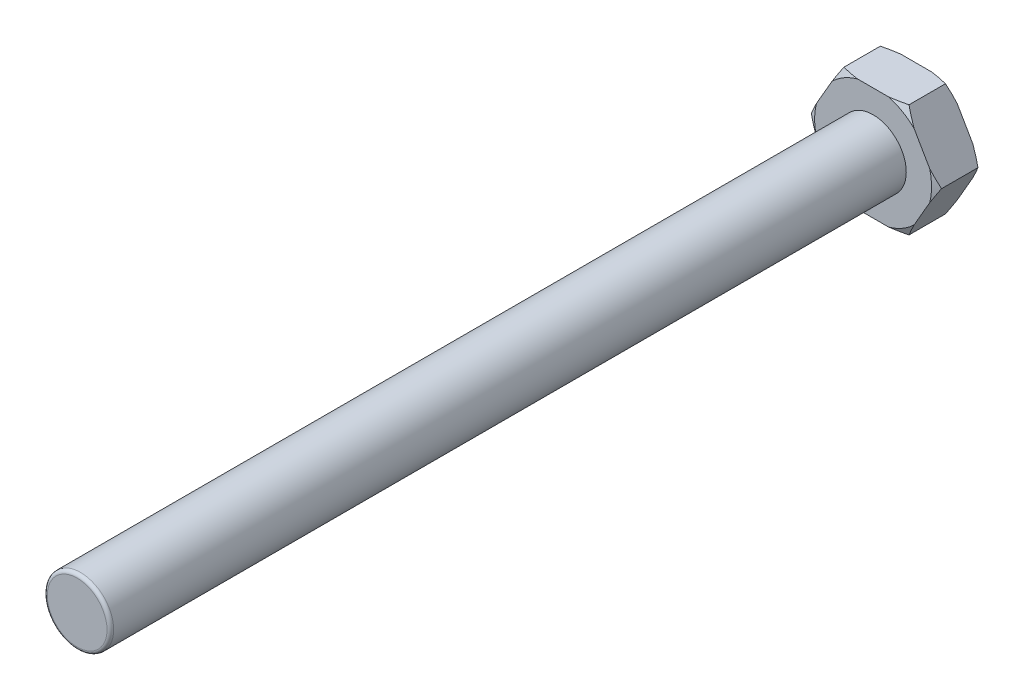
ISO-10303-21;
HEADER;
FILE_DESCRIPTION(('STEP AP214'),'2;1');
FILE_NAME('part.step','',(''),(''),'','','');
FILE_SCHEMA(('AUTOMOTIVE_DESIGN { 1 0 10303 214 1 1 1 1 }'));
ENDSEC;
DATA;
#1=APPLICATION_CONTEXT('core data for automotive mechanical design processes');
#2=APPLICATION_PROTOCOL_DEFINITION('international standard','automotive_design',2000,#1);
#3=PRODUCT_CONTEXT('',#1,'mechanical');
#4=PRODUCT('Part','Part','',(#3));
#5=PRODUCT_RELATED_PRODUCT_CATEGORY('part','',(#4));
#6=PRODUCT_DEFINITION_FORMATION('','',#4);
#7=PRODUCT_DEFINITION_CONTEXT('part definition',#1,'design');
#8=PRODUCT_DEFINITION('design','',#6,#7);
#9=PRODUCT_DEFINITION_SHAPE('','',#8);
#10=(LENGTH_UNIT() NAMED_UNIT(*) SI_UNIT(.MILLI.,.METRE.));
#11=(NAMED_UNIT(*) PLANE_ANGLE_UNIT() SI_UNIT($,.RADIAN.));
#12=(NAMED_UNIT(*) SI_UNIT($,.STERADIAN.) SOLID_ANGLE_UNIT());
#13=UNCERTAINTY_MEASURE_WITH_UNIT(LENGTH_MEASURE(1.E-05),#10,'distance_accuracy_value','');
#14=(GEOMETRIC_REPRESENTATION_CONTEXT(3) GLOBAL_UNCERTAINTY_ASSIGNED_CONTEXT((#13)) GLOBAL_UNIT_ASSIGNED_CONTEXT((#10,
#11,#12)) REPRESENTATION_CONTEXT('',''));
#15=CARTESIAN_POINT('',(0.,0.,0.));
#16=DIRECTION('',(0.,0.,1.));
#17=DIRECTION('',(1.,0.,0.));
#18=AXIS2_PLACEMENT_3D('',#15,#16,#17);
#19=CARTESIAN_POINT('',(0.,0.,6.5));
#20=DIRECTION('',(0.,0.,1.));
#21=DIRECTION('',(1.,0.,0.));
#22=AXIS2_PLACEMENT_3D('',#19,#20,#21);
#23=PLANE('',#22);
#24=CARTESIAN_POINT('',(0.,0.,6.5));
#25=DIRECTION('',(0.,0.,1.));
#26=DIRECTION('',(1.,0.,0.));
#27=AXIS2_PLACEMENT_3D('',#24,#25,#26);
#28=CIRCLE('',#27,5.);
#29=CARTESIAN_POINT('',(5.,0.,6.5));
#30=VERTEX_POINT('',#29);
#31=EDGE_CURVE('E219',#30,#30,#28,.T.);
#32=ORIENTED_EDGE('',*,*,#31,.F.);
#33=EDGE_LOOP('',(#32));
#34=FACE_BOUND('',#33,.T.);
#35=CARTESIAN_POINT('',(0.,0.,6.5));
#36=DIRECTION('',(0.,0.,1.));
#37=DIRECTION('',(1.,0.,0.));
#38=AXIS2_PLACEMENT_3D('',#35,#36,#37);
#39=CIRCLE('',#38,8.8149545762236);
#40=CARTESIAN_POINT('',(6.19358754726897,-6.27239168700426,6.5));
#41=VERTEX_POINT('',#40);
#42=CARTESIAN_POINT('',(2.33525676979781,-8.49999999999994,6.5));
#43=VERTEX_POINT('',#42);
#44=EDGE_CURVE('E226',#41,#43,#39,.F.);
#45=ORIENTED_EDGE('',*,*,#44,.F.);
#46=DIRECTION('',(0.499999999999995,0.866025403784442,0.));
#47=VECTOR('',#46,1.);
#48=CARTESIAN_POINT('',(4.9074772881119,-8.49999999999991,6.5));
#49=LINE('',#48,#47);
#50=CARTESIAN_POINT('',(8.52884431706653,-2.22760831299566,6.5));
#51=VERTEX_POINT('',#50);
#52=EDGE_CURVE('E202',#41,#51,#49,.T.);
#53=ORIENTED_EDGE('',*,*,#52,.T.);
#54=CARTESIAN_POINT('',(8.52884431706655,2.22760831299558,6.5));
#55=VERTEX_POINT('',#54);
#56=EDGE_CURVE('E224',#55,#51,#39,.F.);
#57=ORIENTED_EDGE('',*,*,#56,.F.);
#58=DIRECTION('',(-0.500000000000001,0.866025403784438,0.));
#59=VECTOR('',#58,1.);
#60=CARTESIAN_POINT('',(9.8149545762236,0.,6.5));
#61=LINE('',#60,#59);
#62=CARTESIAN_POINT('',(6.19358754726883,6.2723916870044,6.5));
#63=VERTEX_POINT('',#62);
#64=EDGE_CURVE('E257',#55,#63,#61,.T.);
#65=ORIENTED_EDGE('',*,*,#64,.T.);
#66=CARTESIAN_POINT('',(2.33525676979769,8.49999999999997,6.5));
#67=VERTEX_POINT('',#66);
#68=EDGE_CURVE('E225',#67,#63,#39,.F.);
#69=ORIENTED_EDGE('',*,*,#68,.F.);
#70=DIRECTION('',(-1.,0.,0.));
#71=VECTOR('',#70,1.);
#72=CARTESIAN_POINT('',(4.90747728811178,8.49999999999998,6.5));
#73=LINE('',#72,#71);
#74=CARTESIAN_POINT('',(-2.33525676979774,8.49999999999996,6.5));
#75=VERTEX_POINT('',#74);
#76=EDGE_CURVE('E263',#67,#75,#73,.T.);
#77=ORIENTED_EDGE('',*,*,#76,.T.);
#78=CARTESIAN_POINT('',(-6.19358754726888,6.27239168700436,6.5));
#79=VERTEX_POINT('',#78);
#80=EDGE_CURVE('E236',#79,#75,#39,.F.);
#81=ORIENTED_EDGE('',*,*,#80,.F.);
#82=DIRECTION('',(-0.499999999999995,-0.866025403784442,0.));
#83=VECTOR('',#82,1.);
#84=CARTESIAN_POINT('',(-4.90747728811184,8.49999999999995,6.5));
#85=LINE('',#84,#83);
#86=CARTESIAN_POINT('',(-8.52884431706657,2.22760831299552,6.5));
#87=VERTEX_POINT('',#86);
#88=EDGE_CURVE('E265',#79,#87,#85,.T.);
#89=ORIENTED_EDGE('',*,*,#88,.T.);
#90=CARTESIAN_POINT('',(-8.52884431706654,-2.22760831299564,6.5));
#91=VERTEX_POINT('',#90);
#92=EDGE_CURVE('E234',#91,#87,#39,.F.);
#93=ORIENTED_EDGE('',*,*,#92,.F.);
#94=DIRECTION('',(0.500000000000007,-0.866025403784434,0.));
#95=VECTOR('',#94,1.);
#96=CARTESIAN_POINT('',(-9.8149545762236,0.,6.5));
#97=LINE('',#96,#95);
#98=CARTESIAN_POINT('',(-6.19358754726878,-6.27239168700445,6.5));
#99=VERTEX_POINT('',#98);
#100=EDGE_CURVE('E272',#91,#99,#97,.T.);
#101=ORIENTED_EDGE('',*,*,#100,.T.);
#102=CARTESIAN_POINT('',(-2.33525676979763,-8.49999999999999,6.5));
#103=VERTEX_POINT('',#102);
#104=EDGE_CURVE('E230',#103,#99,#39,.F.);
#105=ORIENTED_EDGE('',*,*,#104,.F.);
#106=DIRECTION('',(1.,0.,0.));
#107=VECTOR('',#106,1.);
#108=CARTESIAN_POINT('',(-4.90747728811172,-8.50000000000001,6.5));
#109=LINE('',#108,#107);
#110=EDGE_CURVE('E207',#103,#43,#109,.T.);
#111=ORIENTED_EDGE('',*,*,#110,.T.);
#112=EDGE_LOOP('',(#45,#53,#57,#65,#69,#77,#81,#89,#93,#101,#105,#111));
#113=FACE_BOUND('',#112,.T.);
#114=ADVANCED_FACE('F38',(#34,#113),#23,.T.);
#115=CARTESIAN_POINT('',(0.,0.,0.));
#116=DIRECTION('',(0.,0.,1.));
#117=DIRECTION('',(1.,0.,0.));
#118=AXIS2_PLACEMENT_3D('',#115,#116,#117);
#119=PLANE('',#118);
#120=DIRECTION('',(0.499999999999995,0.866025403784442,0.));
#121=VECTOR('',#120,1.);
#122=CARTESIAN_POINT('',(4.9074772881119,-8.49999999999991,0.));
#123=LINE('',#122,#121);
#124=CARTESIAN_POINT('',(6.19358754726897,-6.27239168700427,0.));
#125=VERTEX_POINT('',#124);
#126=CARTESIAN_POINT('',(8.52884431706654,-2.22760831299565,0.));
#127=VERTEX_POINT('',#126);
#128=EDGE_CURVE('E277',#125,#127,#123,.T.);
#129=ORIENTED_EDGE('',*,*,#128,.F.);
#130=CARTESIAN_POINT('',(0.,0.,0.));
#131=DIRECTION('',(0.,0.,1.));
#132=DIRECTION('',(1.,0.,0.));
#133=AXIS2_PLACEMENT_3D('',#130,#131,#132);
#134=CIRCLE('',#133,8.81495457622361);
#135=CARTESIAN_POINT('',(2.33525676979782,-8.49999999999994,0.));
#136=VERTEX_POINT('',#135);
#137=EDGE_CURVE('E223',#125,#136,#134,.F.);
#138=ORIENTED_EDGE('',*,*,#137,.T.);
#139=DIRECTION('',(1.,0.,0.));
#140=VECTOR('',#139,1.);
#141=CARTESIAN_POINT('',(-4.90747728811172,-8.50000000000001,0.));
#142=LINE('',#141,#140);
#143=CARTESIAN_POINT('',(-2.33525676979764,-8.49999999999999,0.));
#144=VERTEX_POINT('',#143);
#145=EDGE_CURVE('E194',#144,#136,#142,.T.);
#146=ORIENTED_EDGE('',*,*,#145,.F.);
#147=CARTESIAN_POINT('',(-6.19358754726878,-6.27239168700445,0.));
#148=VERTEX_POINT('',#147);
#149=EDGE_CURVE('E595',#144,#148,#134,.F.);
#150=ORIENTED_EDGE('',*,*,#149,.T.);
#151=DIRECTION('',(0.500000000000007,-0.866025403784434,0.));
#152=VECTOR('',#151,1.);
#153=CARTESIAN_POINT('',(-9.8149545762236,0.,0.));
#154=LINE('',#153,#152);
#155=CARTESIAN_POINT('',(-8.52884431706654,-2.22760831299563,0.));
#156=VERTEX_POINT('',#155);
#157=EDGE_CURVE('E190',#156,#148,#154,.T.);
#158=ORIENTED_EDGE('',*,*,#157,.F.);
#159=CARTESIAN_POINT('',(-8.52884431706657,2.22760831299551,0.));
#160=VERTEX_POINT('',#159);
#161=EDGE_CURVE('E172',#156,#160,#134,.F.);
#162=ORIENTED_EDGE('',*,*,#161,.T.);
#163=DIRECTION('',(-0.499999999999995,-0.866025403784442,0.));
#164=VECTOR('',#163,1.);
#165=CARTESIAN_POINT('',(-4.90747728811184,8.49999999999995,0.));
#166=LINE('',#165,#164);
#167=CARTESIAN_POINT('',(-6.19358754726887,6.27239168700436,0.));
#168=VERTEX_POINT('',#167);
#169=EDGE_CURVE('E180',#168,#160,#166,.T.);
#170=ORIENTED_EDGE('',*,*,#169,.F.);
#171=CARTESIAN_POINT('',(-2.33525676979775,8.49999999999995,0.));
#172=VERTEX_POINT('',#171);
#173=EDGE_CURVE('E162',#168,#172,#134,.F.);
#174=ORIENTED_EDGE('',*,*,#173,.T.);
#175=DIRECTION('',(-1.,0.,0.));
#176=VECTOR('',#175,1.);
#177=CARTESIAN_POINT('',(4.90747728811178,8.49999999999998,0.));
#178=LINE('',#177,#176);
#179=CARTESIAN_POINT('',(2.33525676979769,8.49999999999997,0.));
#180=VERTEX_POINT('',#179);
#181=EDGE_CURVE('E191',#180,#172,#178,.T.);
#182=ORIENTED_EDGE('',*,*,#181,.F.);
#183=CARTESIAN_POINT('',(6.19358754726883,6.27239168700441,0.));
#184=VERTEX_POINT('',#183);
#185=EDGE_CURVE('E173',#180,#184,#134,.F.);
#186=ORIENTED_EDGE('',*,*,#185,.T.);
#187=DIRECTION('',(-0.500000000000001,0.866025403784438,0.));
#188=VECTOR('',#187,1.);
#189=CARTESIAN_POINT('',(9.8149545762236,0.,0.));
#190=LINE('',#189,#188);
#191=CARTESIAN_POINT('',(8.52884431706655,2.22760831299557,0.));
#192=VERTEX_POINT('',#191);
#193=EDGE_CURVE('E196',#192,#184,#190,.T.);
#194=ORIENTED_EDGE('',*,*,#193,.F.);
#195=EDGE_CURVE('E220',#192,#127,#134,.F.);
#196=ORIENTED_EDGE('',*,*,#195,.T.);
#197=EDGE_LOOP('',(#129,#138,#146,#150,#158,#162,#170,#174,#182,#186,#194,#196));
#198=FACE_BOUND('',#197,.T.);
#199=ADVANCED_FACE('F188',(#198),#119,.F.);
#200=CARTESIAN_POINT('',(4.9074772881119,-8.49999999999991,6.5));
#201=DIRECTION('',(-0.866025403784442,0.499999999999995,0.));
#202=DIRECTION('',(-0.499999999999995,-0.866025403784442,0.));
#203=AXIS2_PLACEMENT_3D('',#200,#201,#202);
#204=PLANE('',#203);
#205=DIRECTION('',(0.,0.,-1.));
#206=VECTOR('',#205,1.);
#207=CARTESIAN_POINT('',(4.9074772881119,-8.49999999999991,6.5));
#208=LINE('',#207,#206);
#209=CARTESIAN_POINT('',(4.9074772881119,-8.49999999999991,6.));
#210=VERTEX_POINT('',#209);
#211=CARTESIAN_POINT('',(4.9074772881119,-8.49999999999991,0.5));
#212=VERTEX_POINT('',#211);
#213=EDGE_CURVE('E203',#210,#212,#208,.T.);
#214=ORIENTED_EDGE('',*,*,#213,.T.);
#215=CARTESIAN_POINT('',(4.90707314292347,-8.50069999999991,0.500202085074657));
#216=CARTESIAN_POINT('',(5.04539648047627,-8.26111695148596,0.431037001478398));
#217=CARTESIAN_POINT('',(5.18425872801676,-8.02060048349262,0.365975934098762));
#218=CARTESIAN_POINT('',(5.46308933900157,-7.53765169856145,0.245431881458196));
#219=CARTESIAN_POINT('',(5.6030582335775,-7.29521846167668,0.189953829261577));
#220=CARTESIAN_POINT('',(5.88419637238113,-6.80827292132343,0.0899457379592984));
#221=CARTESIAN_POINT('',(6.02536708724482,-6.56375807063871,0.0454320334196549));
#222=CARTESIAN_POINT('',(6.30853248030514,-6.073301222913,-0.03116883403363));
#223=CARTESIAN_POINT('',(6.45052701218303,-5.82735947930354,-0.0632581389788478));
#224=CARTESIAN_POINT('',(6.73189823105374,-5.34001023243189,-0.113316379068072));
#225=CARTESIAN_POINT('',(6.8712612725106,-5.09862636393127,-0.131588987679441));
#226=CARTESIAN_POINT('',(7.15027760794054,-4.61535589482493,-0.154517426261983));
#227=CARTESIAN_POINT('',(7.28993091588696,-4.37346927001667,-0.159172584752788));
#228=CARTESIAN_POINT('',(7.56903063475879,-3.89005437655246,-0.154685571909232));
#229=CARTESIAN_POINT('',(7.70847710644297,-3.64852600265924,-0.145558266834539));
#230=CARTESIAN_POINT('',(7.98697270856634,-3.16615747009707,-0.1138855746116));
#231=CARTESIAN_POINT('',(8.12602187186111,-2.92531725452058,-0.0913413312657054));
#232=CARTESIAN_POINT('',(8.3947556071356,-2.4598567713174,-0.0354617719109684));
#233=CARTESIAN_POINT('',(8.52448055000392,-2.23516657926049,-0.00289193103303866));
#234=CARTESIAN_POINT('',(8.78320155681667,-1.78704865047542,0.0723911259197545));
#235=CARTESIAN_POINT('',(8.91219754131855,-1.5636210513458,0.115105426524687));
#236=CARTESIAN_POINT('',(9.17078093553374,-1.11574147457147,0.210140846061156));
#237=CARTESIAN_POINT('',(9.30035889198645,-0.891305870454437,0.262563810605361));
#238=CARTESIAN_POINT('',(9.55856371514585,-0.444081997983007,0.375552841414267));
#239=CARTESIAN_POINT('',(9.68719099742968,-0.221293009827918,0.436115096597843));
#240=CARTESIAN_POINT('',(9.81535872141204,0.000699999999999254,0.500202085074658));
#241=B_SPLINE_CURVE_WITH_KNOTS('',3,(#215,#216,#217,#218,#219,#220,#221,#222,#223,#224,#225,
#226,#227,#228,#229,#230,#231,#232,#233,#234,#235,#236,#237,#238,#239,#240),.UNSPECIFIED.,.F.,
.F.,(4,2,2,2,2,2,2,2,2,2,2,2,4),(0.,0.855528802068646,1.71149670206993,2.56873220389179,
3.42581984794328,4.26347350481422,5.1011684659308,5.93796050441598,6.77468121607495,
7.55892436859336,8.34325140122722,9.13632729979281,9.92903313979536),.UNSPECIFIED.);
#242=EDGE_CURVE('E335',#212,#125,#241,.T.);
#243=ORIENTED_EDGE('',*,*,#242,.T.);
#244=ORIENTED_EDGE('',*,*,#128,.T.);
#245=CARTESIAN_POINT('',(9.8149545762236,0.,0.5));
#246=VERTEX_POINT('',#245);
#247=EDGE_CURVE('E602',#127,#246,#241,.T.);
#248=ORIENTED_EDGE('',*,*,#247,.T.);
#249=DIRECTION('',(0.,0.,-1.));
#250=VECTOR('',#249,1.);
#251=CARTESIAN_POINT('',(9.8149545762236,0.,6.5));
#252=LINE('',#251,#250);
#253=CARTESIAN_POINT('',(9.8149545762236,0.,6.));
#254=VERTEX_POINT('',#253);
#255=EDGE_CURVE('E217',#254,#246,#252,.T.);
#256=ORIENTED_EDGE('',*,*,#255,.F.);
#257=CARTESIAN_POINT('',(9.81535872141204,0.0007,5.99979791492534));
#258=CARTESIAN_POINT('',(9.67703538385924,-0.238883048513955,6.0689629985216));
#259=CARTESIAN_POINT('',(9.53817313631875,-0.479399516507293,6.13402406590124));
#260=CARTESIAN_POINT('',(9.25934252533394,-0.962348301438459,6.2545681185418));
#261=CARTESIAN_POINT('',(9.119373630758,-1.20478153832323,6.31004617073842));
#262=CARTESIAN_POINT('',(8.83823549195437,-1.69172707867648,6.4100542620407));
#263=CARTESIAN_POINT('',(8.69706477709069,-1.93624192936121,6.45456796658034));
#264=CARTESIAN_POINT('',(8.41389938403036,-2.42669877708691,6.53116883403363));
#265=CARTESIAN_POINT('',(8.27190485215247,-2.67264052069637,6.56325813897885));
#266=CARTESIAN_POINT('',(7.99053363328177,-3.15998976756802,6.61331637906807));
#267=CARTESIAN_POINT('',(7.8511705918249,-3.40137363606864,6.63158898767944));
#268=CARTESIAN_POINT('',(7.57215425639497,-3.88464410517498,6.65451742626198));
#269=CARTESIAN_POINT('',(7.43250094844855,-4.12653072998324,6.65917258475279));
#270=CARTESIAN_POINT('',(7.15340122957671,-4.60994562344745,6.65468557190923));
#271=CARTESIAN_POINT('',(7.01395475789253,-4.85147399734067,6.64555826683454));
#272=CARTESIAN_POINT('',(6.73545915576916,-5.33384252990285,6.6138855746116));
#273=CARTESIAN_POINT('',(6.59640999247439,-5.57468274547934,6.59134133126571));
#274=CARTESIAN_POINT('',(6.3276762571999,-6.04014322868252,6.53546177191097));
#275=CARTESIAN_POINT('',(6.19795131433158,-6.26483342073942,6.50289193103304));
#276=CARTESIAN_POINT('',(5.93923030751883,-6.71295134952449,6.42760887408024));
#277=CARTESIAN_POINT('',(5.81023432301695,-6.93637894865411,6.38489457347531));
#278=CARTESIAN_POINT('',(5.55165092880176,-7.38425852542844,6.28985915393884));
#279=CARTESIAN_POINT('',(5.42207297234905,-7.60869412954548,6.23743618939464));
#280=CARTESIAN_POINT('',(5.16386814918965,-8.05591800201691,6.12444715858573));
#281=CARTESIAN_POINT('',(5.03524086690583,-8.278706990172,6.06388490340216));
#282=CARTESIAN_POINT('',(4.90707314292347,-8.50069999999991,5.99979791492534));
#283=B_SPLINE_CURVE_WITH_KNOTS('',3,(#257,#258,#259,#260,#261,#262,#263,#264,#265,#266,#267,
#268,#269,#270,#271,#272,#273,#274,#275,#276,#277,#278,#279,#280,#281,#282),.UNSPECIFIED.,.F.,
.F.,(4,2,2,2,2,2,2,2,2,2,2,2,4),(0.,0.855528802068646,1.71149670206993,2.56873220389179,
3.42581984794329,4.26347350481422,5.1011684659308,5.93796050441599,6.77468121607495,
7.55892436859337,8.34325140122722,9.13632729979281,9.92903313979536),.UNSPECIFIED.);
#284=EDGE_CURVE('E279',#254,#51,#283,.T.);
#285=ORIENTED_EDGE('',*,*,#284,.T.);
#286=ORIENTED_EDGE('',*,*,#52,.F.);
#287=EDGE_CURVE('E371',#41,#210,#283,.T.);
#288=ORIENTED_EDGE('',*,*,#287,.T.);
#289=EDGE_LOOP('',(#214,#243,#244,#248,#256,#285,#286,#288));
#290=FACE_BOUND('',#289,.T.);
#291=ADVANCED_FACE('F384',(#290),#204,.F.);
#292=CARTESIAN_POINT('',(9.8149545762236,0.,6.5));
#293=DIRECTION('',(-0.866025403784438,-0.500000000000001,0.));
#294=DIRECTION('',(0.500000000000001,-0.866025403784438,0.));
#295=AXIS2_PLACEMENT_3D('',#292,#293,#294);
#296=PLANE('',#295);
#297=ORIENTED_EDGE('',*,*,#255,.T.);
#298=CARTESIAN_POINT('',(9.81535872141204,-0.000700000000000181,0.500202085074658));
#299=CARTESIAN_POINT('',(9.67703538385923,0.238883048513955,0.431037001478398));
#300=CARTESIAN_POINT('',(9.53817313631874,0.479399516507292,0.365975934098762));
#301=CARTESIAN_POINT('',(9.25934252533393,0.962348301438457,0.245431881458193));
#302=CARTESIAN_POINT('',(9.11937363075799,1.20478153832323,0.189953829261573));
#303=CARTESIAN_POINT('',(8.83823549195436,1.69172707867648,0.0899457379592926));
#304=CARTESIAN_POINT('',(8.69706477709067,1.9362419293612,0.0454320334196488));
#305=CARTESIAN_POINT('',(8.41389938403034,2.42669877708691,-0.031168834033639));
#306=CARTESIAN_POINT('',(8.27190485215245,2.67264052069637,-0.0632581389788593));
#307=CARTESIAN_POINT('',(7.99053363328174,3.15998976756801,-0.113316379068086));
#308=CARTESIAN_POINT('',(7.85117059182488,3.40137363606863,-0.131588987679455));
#309=CARTESIAN_POINT('',(7.57215425639493,3.88464410517497,-0.154517426261998));
#310=CARTESIAN_POINT('',(7.43250094844851,4.12653072998324,-0.159172584752804));
#311=CARTESIAN_POINT('',(7.15340122957668,4.60994562344745,-0.15468557190925));
#312=CARTESIAN_POINT('',(7.0139547578925,4.85147399734066,-0.145558266834557));
#313=CARTESIAN_POINT('',(6.73545915576912,5.33384252990284,-0.113885574611619));
#314=CARTESIAN_POINT('',(6.59640999247434,5.57468274547933,-0.0913413312657253));
#315=CARTESIAN_POINT('',(6.32767625719985,6.04014322868251,-0.0354617719109885));
#316=CARTESIAN_POINT('',(6.19795131433152,6.26483342073942,-0.00289193103305775));
#317=CARTESIAN_POINT('',(5.93923030751876,6.71295134952451,0.0723911259197379));
#318=CARTESIAN_POINT('',(5.81023432301688,6.93637894865414,0.115105426524672));
#319=CARTESIAN_POINT('',(5.55165092880167,7.38425852542848,0.210140846061144));
#320=CARTESIAN_POINT('',(5.42207297234896,7.60869412954552,0.262563810605351));
#321=CARTESIAN_POINT('',(5.16386814918955,8.05591800201696,0.375552841414262));
#322=CARTESIAN_POINT('',(5.03524086690572,8.27870699017206,0.43611509659784));
#323=CARTESIAN_POINT('',(4.90707314292335,8.50069999999998,0.500202085074658));
#324=B_SPLINE_CURVE_WITH_KNOTS('',3,(#298,#299,#300,#301,#302,#303,#304,#305,#306,#307,#308,
#309,#310,#311,#312,#313,#314,#315,#316,#317,#318,#319,#320,#321,#322,#323),.UNSPECIFIED.,.F.,
.F.,(4,2,2,2,2,2,2,2,2,2,2,2,4),(0.,0.855528802068648,1.71149670206993,2.56873220389179,
3.4258198479433,4.26347350481423,5.10116846593081,5.937960504416,6.77468121607496,
7.55892436859341,8.34325140122729,9.1363272997929,9.92903313979548),.UNSPECIFIED.);
#325=EDGE_CURVE('E284',#246,#192,#324,.T.);
#326=ORIENTED_EDGE('',*,*,#325,.T.);
#327=ORIENTED_EDGE('',*,*,#193,.T.);
#328=CARTESIAN_POINT('',(4.90747728811178,8.49999999999998,0.5));
#329=VERTEX_POINT('',#328);
#330=EDGE_CURVE('E283',#184,#329,#324,.T.);
#331=ORIENTED_EDGE('',*,*,#330,.T.);
#332=DIRECTION('',(0.,0.,-1.));
#333=VECTOR('',#332,1.);
#334=CARTESIAN_POINT('',(4.90747728811178,8.49999999999998,6.5));
#335=LINE('',#334,#333);
#336=CARTESIAN_POINT('',(4.90747728811178,8.49999999999998,6.));
#337=VERTEX_POINT('',#336);
#338=EDGE_CURVE('E214',#337,#329,#335,.T.);
#339=ORIENTED_EDGE('',*,*,#338,.F.);
#340=CARTESIAN_POINT('',(4.90707314292335,8.50069999999998,5.99979791492534));
#341=CARTESIAN_POINT('',(5.04539648047615,8.26111695148603,6.0689629985216));
#342=CARTESIAN_POINT('',(5.18425872801665,8.02060048349269,6.13402406590124));
#343=CARTESIAN_POINT('',(5.46308933900146,7.53765169856153,6.25456811854181));
#344=CARTESIAN_POINT('',(5.60305823357739,7.29521846167675,6.31004617073843));
#345=CARTESIAN_POINT('',(5.88419637238103,6.8082729213235,6.41005426204071));
#346=CARTESIAN_POINT('',(6.02536708724472,6.56375807063878,6.45456796658035));
#347=CARTESIAN_POINT('',(6.30853248030505,6.07330122291307,6.53116883403364));
#348=CARTESIAN_POINT('',(6.45052701218294,5.82735947930361,6.56325813897886));
#349=CARTESIAN_POINT('',(6.73189823105364,5.34001023243197,6.61331637906809));
#350=CARTESIAN_POINT('',(6.87126127251051,5.09862636393135,6.63158898767945));
#351=CARTESIAN_POINT('',(7.15027760794045,4.61535589482501,6.654517426262));
#352=CARTESIAN_POINT('',(7.28993091588687,4.37346927001674,6.65917258475281));
#353=CARTESIAN_POINT('',(7.56903063475871,3.89005437655253,6.65468557190925));
#354=CARTESIAN_POINT('',(7.70847710644289,3.64852600265932,6.64555826683456));
#355=CARTESIAN_POINT('',(7.98697270856627,3.16615747009714,6.61388557461162));
#356=CARTESIAN_POINT('',(8.12602187186104,2.92531725452065,6.59134133126572));
#357=CARTESIAN_POINT('',(8.39475560713554,2.45985677131747,6.53546177191099));
#358=CARTESIAN_POINT('',(8.52448055000387,2.23516657926056,6.50289193103306));
#359=CARTESIAN_POINT('',(8.78320155681663,1.78704865047547,6.42760887408026));
#360=CARTESIAN_POINT('',(8.91219754131851,1.56362105134585,6.38489457347533));
#361=CARTESIAN_POINT('',(9.17078093553372,1.1157414745715,6.28985915393886));
#362=CARTESIAN_POINT('',(9.30035889198643,0.891305870454463,6.23743618939465));
#363=CARTESIAN_POINT('',(9.55856371514584,0.44408199798302,6.12444715858574));
#364=CARTESIAN_POINT('',(9.68719099742967,0.221293009827924,6.06388490340216));
#365=CARTESIAN_POINT('',(9.81535872141204,-0.000699999999999481,5.99979791492534));
#366=B_SPLINE_CURVE_WITH_KNOTS('',3,(#340,#341,#342,#343,#344,#345,#346,#347,#348,#349,#350,
#351,#352,#353,#354,#355,#356,#357,#358,#359,#360,#361,#362,#363,#364,#365),.UNSPECIFIED.,.F.,
.F.,(4,2,2,2,2,2,2,2,2,2,2,2,4),(0.,0.855528802068649,1.71149670206993,2.56873220389179,
3.4258198479433,4.26347350481423,5.10116846593082,5.937960504416,6.77468121607497,
7.55892436859341,8.34325140122729,9.1363272997929,9.92903313979548),.UNSPECIFIED.);
#367=EDGE_CURVE('E245',#337,#63,#366,.T.);
#368=ORIENTED_EDGE('',*,*,#367,.T.);
#369=ORIENTED_EDGE('',*,*,#64,.F.);
#370=EDGE_CURVE('E259',#55,#254,#366,.T.);
#371=ORIENTED_EDGE('',*,*,#370,.T.);
#372=EDGE_LOOP('',(#297,#326,#327,#331,#339,#368,#369,#371));
#373=FACE_BOUND('',#372,.T.);
#374=ADVANCED_FACE('F255',(#373),#296,.F.);
#375=CARTESIAN_POINT('',(4.90747728811178,8.49999999999998,6.5));
#376=DIRECTION('',(0.,-1.,0.));
#377=DIRECTION('',(1.,0.,0.));
#378=AXIS2_PLACEMENT_3D('',#375,#376,#377);
#379=PLANE('',#378);
#380=ORIENTED_EDGE('',*,*,#338,.T.);
#381=CARTESIAN_POINT('',(4.90817728811178,8.49999999999998,0.500175009360382));
#382=CARTESIAN_POINT('',(4.63153297287082,8.49999999999998,0.431011657936858));
#383=CARTESIAN_POINT('',(4.35381085298517,8.49999999999998,0.365952333331763));
#384=CARTESIAN_POINT('',(3.79615443140122,8.49999999999998,0.245411752584145));
#385=CARTESIAN_POINT('',(3.51621906749012,8.49999999999998,0.189935429371367));
#386=CARTESIAN_POINT('',(2.95394774515309,8.49999999999998,0.0899307536760243));
#387=CARTESIAN_POINT('',(2.67160884583728,8.49999999999998,0.0454187340508896));
#388=CARTESIAN_POINT('',(2.10528319137797,8.49999999999997,-0.031178874757989));
#389=CARTESIAN_POINT('',(1.82129672885462,8.49999999999997,-0.0632666059180129));
#390=CARTESIAN_POINT('',(1.25855934007068,8.49999999999997,-0.113321921768322));
#391=CARTESIAN_POINT('',(0.979835702467496,8.49999999999997,-0.131593168118284));
#392=CARTESIAN_POINT('',(0.42180798775863,8.49999999999997,-0.15451909164801));
#393=CARTESIAN_POINT('',(0.142503882708562,8.49999999999997,-0.159173097334956));
#394=CARTESIAN_POINT('',(-0.41569050182283,8.49999999999996,-0.154684037284011));
#395=CARTESIAN_POINT('',(-0.694580902869391,8.49999999999996,-0.145555836737082));
#396=CARTESIAN_POINT('',(-1.251566995335,8.49999999999996,-0.113881635828811));
#397=CARTESIAN_POINT('',(-1.52966275246908,8.49999999999996,-0.0913367792735766));
#398=CARTESIAN_POINT('',(-2.06711447651765,8.49999999999996,-0.0354574283468648));
#399=CARTESIAN_POINT('',(-2.32655123389442,8.49999999999996,-0.00288884985926849));
#400=CARTESIAN_POINT('',(-2.8439671263233,8.49999999999996,0.0723906454720999));
#401=CARTESIAN_POINT('',(-3.10194610257543,8.49999999999995,0.115102646262989));
#402=CARTESIAN_POINT('',(-3.61908674231792,8.49999999999995,0.210132526511783));
#403=CARTESIAN_POINT('',(-3.8782295025633,8.49999999999995,0.262552234801542));
#404=CARTESIAN_POINT('',(-4.39461305854492,8.49999999999995,0.375534022020311));
#405=CARTESIAN_POINT('',(-4.65185468518221,8.49999999999995,0.436092290978481));
#406=CARTESIAN_POINT('',(-4.90817728811184,8.49999999999995,0.500175009360383));
#407=B_SPLINE_CURVE_WITH_KNOTS('',3,(#381,#382,#383,#384,#385,#386,#387,#388,#389,#390,#391,
#392,#393,#394,#395,#396,#397,#398,#399,#400,#401,#402,#403,#404,#405,#406),.UNSPECIFIED.,.F.,
.F.,(4,2,2,2,2,2,2,2,2,2,2,2,4),(0.,0.85552067164564,1.71148042577707,2.56870764318049,
3.42578700674063,4.26343308200266,5.10112046253773,5.93790497670447,6.77461816295225,
7.55882180151689,8.3431092794453,9.13614458520281,9.92880992573493),.UNSPECIFIED.);
#408=EDGE_CURVE('E289',#329,#180,#407,.T.);
#409=ORIENTED_EDGE('',*,*,#408,.T.);
#410=ORIENTED_EDGE('',*,*,#181,.T.);
#411=CARTESIAN_POINT('',(-4.90747728811184,8.49999999999995,0.5));
#412=VERTEX_POINT('',#411);
#413=EDGE_CURVE('E167',#172,#412,#407,.T.);
#414=ORIENTED_EDGE('',*,*,#413,.T.);
#415=DIRECTION('',(0.,0.,-1.));
#416=VECTOR('',#415,1.);
#417=CARTESIAN_POINT('',(-4.90747728811184,8.49999999999995,6.5));
#418=LINE('',#417,#416);
#419=CARTESIAN_POINT('',(-4.90747728811184,8.49999999999995,6.));
#420=VERTEX_POINT('',#419);
#421=EDGE_CURVE('E183',#420,#412,#418,.T.);
#422=ORIENTED_EDGE('',*,*,#421,.F.);
#423=CARTESIAN_POINT('',(-4.90817728811184,8.49999999999995,5.99982499063962));
#424=CARTESIAN_POINT('',(-4.63153297287088,8.49999999999995,6.06898834206314));
#425=CARTESIAN_POINT('',(-4.35381085298522,8.49999999999995,6.13404766666824));
#426=CARTESIAN_POINT('',(-3.79615443140128,8.49999999999995,6.25458824741585));
#427=CARTESIAN_POINT('',(-3.51621906749018,8.49999999999995,6.31006457062863));
#428=CARTESIAN_POINT('',(-2.95394774515315,8.49999999999995,6.41006924632398));
#429=CARTESIAN_POINT('',(-2.67160884583734,8.49999999999996,6.45458126594911));
#430=CARTESIAN_POINT('',(-2.10528319137803,8.49999999999996,6.53117887475799));
#431=CARTESIAN_POINT('',(-1.82129672885467,8.49999999999996,6.56326660591801));
#432=CARTESIAN_POINT('',(-1.25855934007074,8.49999999999996,6.61332192176832));
#433=CARTESIAN_POINT('',(-0.979835702467551,8.49999999999996,6.63159316811828));
#434=CARTESIAN_POINT('',(-0.421807987758684,8.49999999999996,6.65451909164801));
#435=CARTESIAN_POINT('',(-0.142503882708616,8.49999999999996,6.65917309733496));
#436=CARTESIAN_POINT('',(0.415690501822775,8.49999999999997,6.65468403728401));
#437=CARTESIAN_POINT('',(0.694580902869337,8.49999999999997,6.64555583673708));
#438=CARTESIAN_POINT('',(1.25156699533495,8.49999999999997,6.61388163582881));
#439=CARTESIAN_POINT('',(1.52966275246903,8.49999999999997,6.59133677927358));
#440=CARTESIAN_POINT('',(2.06711447651759,8.49999999999997,6.53545742834686));
#441=CARTESIAN_POINT('',(2.32655123389436,8.49999999999998,6.50288884985927));
#442=CARTESIAN_POINT('',(2.84396712632325,8.49999999999998,6.4276093545279));
#443=CARTESIAN_POINT('',(3.10194610257537,8.49999999999998,6.38489735373701));
#444=CARTESIAN_POINT('',(3.61908674231787,8.49999999999998,6.28986747348822));
#445=CARTESIAN_POINT('',(3.87822950256325,8.49999999999998,6.23744776519846));
#446=CARTESIAN_POINT('',(4.39461305854486,8.49999999999998,6.12446597797969));
#447=CARTESIAN_POINT('',(4.65185468518215,8.49999999999998,6.06390770902152));
#448=CARTESIAN_POINT('',(4.90817728811178,8.49999999999998,5.99982499063962));
#449=B_SPLINE_CURVE_WITH_KNOTS('',3,(#423,#424,#425,#426,#427,#428,#429,#430,#431,#432,#433,
#434,#435,#436,#437,#438,#439,#440,#441,#442,#443,#444,#445,#446,#447,#448),.UNSPECIFIED.,.F.,
.F.,(4,2,2,2,2,2,2,2,2,2,2,2,4),(0.,0.85552067164564,1.71148042577707,2.56870764318049,
3.42578700674063,4.26343308200267,5.10112046253773,5.93790497670448,6.77461816295225,
7.55882180151689,8.3431092794453,9.13614458520281,9.92880992573493),.UNSPECIFIED.);
#450=EDGE_CURVE('E396',#420,#75,#449,.T.);
#451=ORIENTED_EDGE('',*,*,#450,.T.);
#452=ORIENTED_EDGE('',*,*,#76,.F.);
#453=EDGE_CURVE('E247',#67,#337,#449,.T.);
#454=ORIENTED_EDGE('',*,*,#453,.T.);
#455=EDGE_LOOP('',(#380,#409,#410,#414,#422,#451,#452,#454));
#456=FACE_BOUND('',#455,.T.);
#457=ADVANCED_FACE('F291',(#456),#379,.F.);
#458=CARTESIAN_POINT('',(-4.90747728811184,8.49999999999995,6.5));
#459=DIRECTION('',(0.866025403784442,-0.499999999999995,0.));
#460=DIRECTION('',(0.499999999999995,0.866025403784442,0.));
#461=AXIS2_PLACEMENT_3D('',#458,#459,#460);
#462=PLANE('',#461);
#463=ORIENTED_EDGE('',*,*,#421,.T.);
#464=CARTESIAN_POINT('',(-4.90707314292341,8.50069999999995,0.500202085074658));
#465=CARTESIAN_POINT('',(-5.04539648047621,8.26111695148599,0.431037001478398));
#466=CARTESIAN_POINT('',(-5.1842587280167,8.02060048349266,0.365975934098762));
#467=CARTESIAN_POINT('',(-5.46308933900151,7.53765169856149,0.245431881458193));
#468=CARTESIAN_POINT('',(-5.60305823357744,7.29521846167671,0.189953829261572));
#469=CARTESIAN_POINT('',(-5.88419637238108,6.80827292132346,0.0899457379592917));
#470=CARTESIAN_POINT('',(-6.02536708724476,6.56375807063874,0.0454320334196473));
#471=CARTESIAN_POINT('',(-6.30853248030509,6.07330122291303,-0.0311688340336403));
#472=CARTESIAN_POINT('',(-6.45052701218298,5.82735947930357,-0.06325813897886));
#473=CARTESIAN_POINT('',(-6.73189823105368,5.34001023243192,-0.113316379068087));
#474=CARTESIAN_POINT('',(-6.87126127251054,5.0986263639313,-0.131588987679456));
#475=CARTESIAN_POINT('',(-7.15027760794048,4.61535589482496,-0.154517426261999));
#476=CARTESIAN_POINT('',(-7.2899309158869,4.37346927001669,-0.159172584752805));
#477=CARTESIAN_POINT('',(-7.56903063475874,3.89005437655248,-0.15468557190925));
#478=CARTESIAN_POINT('',(-7.70847710644292,3.64852600265926,-0.145558266834558));
#479=CARTESIAN_POINT('',(-7.98697270856629,3.16615747009709,-0.113885574611621));
#480=CARTESIAN_POINT('',(-8.12602187186106,2.9253172545206,-0.0913413312657264));
#481=CARTESIAN_POINT('',(-8.39475560713555,2.45985677131741,-0.0354617719109894));
#482=CARTESIAN_POINT('',(-8.52448055000388,2.2351665792605,-0.00289193103305854));
#483=CARTESIAN_POINT('',(-8.78320155681664,1.78704865047541,0.0723911259197375));
#484=CARTESIAN_POINT('',(-8.91219754131852,1.56362105134578,0.115105426524672));
#485=CARTESIAN_POINT('',(-9.17078093553372,1.11574147457144,0.210140846061144));
#486=CARTESIAN_POINT('',(-9.30035889198643,0.891305870454394,0.262563810605351));
#487=CARTESIAN_POINT('',(-9.55856371514584,0.44408199798295,0.375552841414261));
#488=CARTESIAN_POINT('',(-9.68719099742967,0.221293009827854,0.436115096597838));
#489=CARTESIAN_POINT('',(-9.81535872141204,-0.000700000000068881,0.500202085074657));
#490=B_SPLINE_CURVE_WITH_KNOTS('',3,(#464,#465,#466,#467,#468,#469,#470,#471,#472,#473,#474,
#475,#476,#477,#478,#479,#480,#481,#482,#483,#484,#485,#486,#487,#488,#489),.UNSPECIFIED.,.F.,
.F.,(4,2,2,2,2,2,2,2,2,2,2,2,4),(0.,0.855528802068648,1.71149670206993,2.56873220389179,
3.4258198479433,4.26347350481424,5.10116846593082,5.93796050441601,6.77468121607497,
7.55892436859341,8.3432514012273,9.13632729979291,9.92903313979548),.UNSPECIFIED.);
#491=EDGE_CURVE('E165',#412,#168,#490,.T.);
#492=ORIENTED_EDGE('',*,*,#491,.T.);
#493=ORIENTED_EDGE('',*,*,#169,.T.);
#494=CARTESIAN_POINT('',(-9.8149545762236,0.,0.5));
#495=VERTEX_POINT('',#494);
#496=EDGE_CURVE('E184',#160,#495,#490,.T.);
#497=ORIENTED_EDGE('',*,*,#496,.T.);
#498=DIRECTION('',(0.,0.,-1.));
#499=VECTOR('',#498,1.);
#500=CARTESIAN_POINT('',(-9.8149545762236,0.,6.5));
#501=LINE('',#500,#499);
#502=CARTESIAN_POINT('',(-9.8149545762236,0.,6.));
#503=VERTEX_POINT('',#502);
#504=EDGE_CURVE('E210',#503,#495,#501,.T.);
#505=ORIENTED_EDGE('',*,*,#504,.F.);
#506=CARTESIAN_POINT('',(-9.81535872141203,-0.000700000000068537,5.99979791492534));
#507=CARTESIAN_POINT('',(-9.67703538385923,0.238883048513888,6.0689629985216));
#508=CARTESIAN_POINT('',(-9.53817313631874,0.479399516507225,6.13402406590124));
#509=CARTESIAN_POINT('',(-9.25934252533393,0.962348301438391,6.25456811854181));
#510=CARTESIAN_POINT('',(-9.119373630758,1.20478153832317,6.31004617073843));
#511=CARTESIAN_POINT('',(-8.83823549195437,1.69172707867642,6.41005426204071));
#512=CARTESIAN_POINT('',(-8.69706477709068,1.93624192936114,6.45456796658035));
#513=CARTESIAN_POINT('',(-8.41389938403035,2.42669877708685,6.53116883403364));
#514=CARTESIAN_POINT('',(-8.27190485215247,2.67264052069631,6.56325813897886));
#515=CARTESIAN_POINT('',(-7.99053363328176,3.15998976756796,6.61331637906809));
#516=CARTESIAN_POINT('',(-7.8511705918249,3.40137363606858,6.63158898767946));
#517=CARTESIAN_POINT('',(-7.57215425639496,3.88464410517492,6.654517426262));
#518=CARTESIAN_POINT('',(-7.43250094844854,4.12653072998318,6.65917258475281));
#519=CARTESIAN_POINT('',(-7.15340122957671,4.60994562344739,6.65468557190925));
#520=CARTESIAN_POINT('',(-7.01395475789253,4.85147399734061,6.64555826683456));
#521=CARTESIAN_POINT('',(-6.73545915576915,5.33384252990279,6.61388557461162));
#522=CARTESIAN_POINT('',(-6.59640999247438,5.57468274547928,6.59134133126573));
#523=CARTESIAN_POINT('',(-6.32767625719989,6.04014322868247,6.53546177191099));
#524=CARTESIAN_POINT('',(-6.19795131433156,6.26483342073938,6.50289193103306));
#525=CARTESIAN_POINT('',(-5.9392303075188,6.71295134952447,6.42760887408026));
#526=CARTESIAN_POINT('',(-5.81023432301692,6.9363789486541,6.38489457347533));
#527=CARTESIAN_POINT('',(-5.55165092880172,7.38425852542844,6.28985915393886));
#528=CARTESIAN_POINT('',(-5.42207297234901,7.60869412954548,6.23743618939465));
#529=CARTESIAN_POINT('',(-5.1638681491896,8.05591800201693,6.12444715858574));
#530=CARTESIAN_POINT('',(-5.03524086690577,8.27870699017202,6.06388490340216));
#531=CARTESIAN_POINT('',(-4.90707314292341,8.50069999999995,5.99979791492534));
#532=B_SPLINE_CURVE_WITH_KNOTS('',3,(#506,#507,#508,#509,#510,#511,#512,#513,#514,#515,#516,
#517,#518,#519,#520,#521,#522,#523,#524,#525,#526,#527,#528,#529,#530,#531),.UNSPECIFIED.,.F.,
.F.,(4,2,2,2,2,2,2,2,2,2,2,2,4),(0.,0.855528802068648,1.71149670206993,2.56873220389179,
3.4258198479433,4.26347350481423,5.10116846593081,5.937960504416,6.77468121607496,
7.55892436859341,8.34325140122729,9.1363272997929,9.92903313979548),.UNSPECIFIED.);
#533=EDGE_CURVE('E378',#503,#87,#532,.T.);
#534=ORIENTED_EDGE('',*,*,#533,.T.);
#535=ORIENTED_EDGE('',*,*,#88,.F.);
#536=EDGE_CURVE('E607',#79,#420,#532,.T.);
#537=ORIENTED_EDGE('',*,*,#536,.T.);
#538=EDGE_LOOP('',(#463,#492,#493,#497,#505,#534,#535,#537));
#539=FACE_BOUND('',#538,.T.);
#540=ADVANCED_FACE('F178',(#539),#462,.F.);
#541=CARTESIAN_POINT('',(-9.8149545762236,0.,6.5));
#542=DIRECTION('',(0.866025403784434,0.500000000000007,0.));
#543=DIRECTION('',(-0.500000000000007,0.866025403784435,0.));
#544=AXIS2_PLACEMENT_3D('',#541,#542,#543);
#545=PLANE('',#544);
#546=ORIENTED_EDGE('',*,*,#504,.T.);
#547=CARTESIAN_POINT('',(-9.81535872141204,0.00069999999993164,0.500202085074657));
#548=CARTESIAN_POINT('',(-9.67703538385923,-0.238883048514022,0.431037001478398));
#549=CARTESIAN_POINT('',(-9.53817313631874,-0.479399516507357,0.365975934098761));
#550=CARTESIAN_POINT('',(-9.25934252533392,-0.962348301438519,0.245431881458192));
#551=CARTESIAN_POINT('',(-9.11937363075799,-1.20478153832329,0.189953829261572));
#552=CARTESIAN_POINT('',(-8.83823549195434,-1.69172707867654,0.0899457379592913));
#553=CARTESIAN_POINT('',(-8.69706477709066,-1.93624192936126,0.0454320334196477));
#554=CARTESIAN_POINT('',(-8.41389938403032,-2.42669877708696,-0.0311688340336397));
#555=CARTESIAN_POINT('',(-8.27190485215243,-2.67264052069642,-0.0632581389788599));
#556=CARTESIAN_POINT('',(-7.99053363328172,-3.15998976756807,-0.113316379068087));
#557=CARTESIAN_POINT('',(-7.85117059182485,-3.40137363606868,-0.131588987679456));
#558=CARTESIAN_POINT('',(-7.57215425639491,-3.88464410517502,-0.154517426262));
#559=CARTESIAN_POINT('',(-7.43250094844848,-4.12653072998328,-0.159172584752806));
#560=CARTESIAN_POINT('',(-7.15340122957665,-4.60994562344749,-0.154685571909251));
#561=CARTESIAN_POINT('',(-7.01395475789246,-4.85147399734071,-0.145558266834558));
#562=CARTESIAN_POINT('',(-6.73545915576908,-5.33384252990288,-0.113885574611621));
#563=CARTESIAN_POINT('',(-6.59640999247431,-5.57468274547937,-0.091341331265727));
#564=CARTESIAN_POINT('',(-6.32767625719981,-6.04014322868255,-0.0354617719109905));
#565=CARTESIAN_POINT('',(-6.19795131433148,-6.26483342073946,-0.00289193103305969));
#566=CARTESIAN_POINT('',(-5.93923030751871,-6.71295134952455,0.072391125919736));
#567=CARTESIAN_POINT('',(-5.81023432301683,-6.93637894865417,0.11510542652467));
#568=CARTESIAN_POINT('',(-5.55165092880162,-7.38425852542851,0.210140846061142));
#569=CARTESIAN_POINT('',(-5.42207297234891,-7.60869412954555,0.26256381060535));
#570=CARTESIAN_POINT('',(-5.16386814918949,-8.055918002017,0.375552841414261));
#571=CARTESIAN_POINT('',(-5.03524086690566,-8.27870699017209,0.436115096597839));
#572=CARTESIAN_POINT('',(-4.90707314292329,-8.50070000000002,0.500202085074657));
#573=B_SPLINE_CURVE_WITH_KNOTS('',3,(#547,#548,#549,#550,#551,#552,#553,#554,#555,#556,#557,
#558,#559,#560,#561,#562,#563,#564,#565,#566,#567,#568,#569,#570,#571,#572),.UNSPECIFIED.,.F.,
.F.,(4,2,2,2,2,2,2,2,2,2,2,2,4),(0.,0.855528802068647,1.71149670206993,2.56873220389179,
3.42581984794329,4.26347350481423,5.10116846593081,5.937960504416,6.77468121607496,
7.5589243685934,8.34325140122729,9.1363272997929,9.92903313979548),.UNSPECIFIED.);
#574=EDGE_CURVE('E348',#495,#156,#573,.T.);
#575=ORIENTED_EDGE('',*,*,#574,.T.);
#576=ORIENTED_EDGE('',*,*,#157,.T.);
#577=CARTESIAN_POINT('',(-4.90747728811172,-8.50000000000002,0.5));
#578=VERTEX_POINT('',#577);
#579=EDGE_CURVE('E341',#148,#578,#573,.T.);
#580=ORIENTED_EDGE('',*,*,#579,.T.);
#581=DIRECTION('',(0.,0.,-1.));
#582=VECTOR('',#581,1.);
#583=CARTESIAN_POINT('',(-4.90747728811172,-8.50000000000001,6.5));
#584=LINE('',#583,#582);
#585=CARTESIAN_POINT('',(-4.90747728811172,-8.50000000000002,6.));
#586=VERTEX_POINT('',#585);
#587=EDGE_CURVE('E206',#586,#578,#584,.T.);
#588=ORIENTED_EDGE('',*,*,#587,.F.);
#589=CARTESIAN_POINT('',(-4.90707314292329,-8.50070000000002,5.99979791492534));
#590=CARTESIAN_POINT('',(-5.04539648047609,-8.26111695148606,6.0689629985216));
#591=CARTESIAN_POINT('',(-5.18425872801659,-8.02060048349273,6.13402406590124));
#592=CARTESIAN_POINT('',(-5.4630893390014,-7.53765169856156,6.25456811854181));
#593=CARTESIAN_POINT('',(-5.60305823357734,-7.29521846167679,6.31004617073843));
#594=CARTESIAN_POINT('',(-5.88419637238098,-6.80827292132354,6.41005426204071));
#595=CARTESIAN_POINT('',(-6.02536708724467,-6.56375807063882,6.45456796658035));
#596=CARTESIAN_POINT('',(-6.308532480305,-6.07330122291312,6.53116883403364));
#597=CARTESIAN_POINT('',(-6.45052701218289,-5.82735947930366,6.56325813897886));
#598=CARTESIAN_POINT('',(-6.7318982310536,-5.34001023243201,6.61331637906809));
#599=CARTESIAN_POINT('',(-6.87126127251047,-5.0986263639314,6.63158898767946));
#600=CARTESIAN_POINT('',(-7.15027760794042,-4.61535589482506,6.654517426262));
#601=CARTESIAN_POINT('',(-7.28993091588684,-4.3734692700168,6.65917258475281));
#602=CARTESIAN_POINT('',(-7.56903063475868,-3.89005437655259,6.65468557190925));
#603=CARTESIAN_POINT('',(-7.70847710644286,-3.64852600265937,6.64555826683456));
#604=CARTESIAN_POINT('',(-7.98697270856625,-3.1661574700972,6.61388557461162));
#605=CARTESIAN_POINT('',(-8.12602187186102,-2.92531725452071,6.59134133126573));
#606=CARTESIAN_POINT('',(-8.39475560713552,-2.45985677131753,6.53546177191099));
#607=CARTESIAN_POINT('',(-8.52448055000385,-2.23516657926062,6.50289193103306));
#608=CARTESIAN_POINT('',(-8.78320155681662,-1.78704865047553,6.42760887408026));
#609=CARTESIAN_POINT('',(-8.9121975413185,-1.56362105134591,6.38489457347533));
#610=CARTESIAN_POINT('',(-9.17078093553371,-1.11574147457157,6.28985915393886));
#611=CARTESIAN_POINT('',(-9.30035889198642,-0.891305870454527,6.23743618939465));
#612=CARTESIAN_POINT('',(-9.55856371514584,-0.444081997983086,6.12444715858574));
#613=CARTESIAN_POINT('',(-9.68719099742967,-0.221293009827991,6.06388490340216));
#614=CARTESIAN_POINT('',(-9.81535872141204,0.000699999999930935,5.99979791492534));
#615=B_SPLINE_CURVE_WITH_KNOTS('',3,(#589,#590,#591,#592,#593,#594,#595,#596,#597,#598,#599,
#600,#601,#602,#603,#604,#605,#606,#607,#608,#609,#610,#611,#612,#613,#614),.UNSPECIFIED.,.F.,
.F.,(4,2,2,2,2,2,2,2,2,2,2,2,4),(0.,0.855528802068647,1.71149670206993,2.56873220389179,
3.4258198479433,4.26347350481423,5.10116846593082,5.937960504416,6.77468121607497,
7.55892436859341,8.34325140122729,9.1363272997929,9.92903313979548),.UNSPECIFIED.);
#616=EDGE_CURVE('E360',#586,#99,#615,.T.);
#617=ORIENTED_EDGE('',*,*,#616,.T.);
#618=ORIENTED_EDGE('',*,*,#100,.F.);
#619=EDGE_CURVE('E61',#91,#503,#615,.T.);
#620=ORIENTED_EDGE('',*,*,#619,.T.);
#621=EDGE_LOOP('',(#546,#575,#576,#580,#588,#617,#618,#620));
#622=FACE_BOUND('',#621,.T.);
#623=ADVANCED_FACE('F350',(#622),#545,.F.);
#624=CARTESIAN_POINT('',(-4.90747728811172,-8.50000000000001,6.5));
#625=DIRECTION('',(0.,1.,0.));
#626=DIRECTION('',(-1.,0.,0.));
#627=AXIS2_PLACEMENT_3D('',#624,#625,#626);
#628=PLANE('',#627);
#629=ORIENTED_EDGE('',*,*,#587,.T.);
#630=CARTESIAN_POINT('',(-4.90817728811172,-8.50000000000001,0.500175009360382));
#631=CARTESIAN_POINT('',(-4.63153297287076,-8.50000000000001,0.431011657936858));
#632=CARTESIAN_POINT('',(-4.3538108529851,-8.50000000000001,0.365952333331763));
#633=CARTESIAN_POINT('',(-3.79615443140116,-8.5,0.245411752584145));
#634=CARTESIAN_POINT('',(-3.51621906749006,-8.5,0.189935429371366));
#635=CARTESIAN_POINT('',(-2.95394774515303,-8.49999999999999,0.0899307536760236));
#636=CARTESIAN_POINT('',(-2.67160884583722,-8.49999999999999,0.0454187340508893));
#637=CARTESIAN_POINT('',(-2.10528319137791,-8.49999999999999,-0.0311788747579891));
#638=CARTESIAN_POINT('',(-1.82129672885456,-8.49999999999998,-0.0632666059180134));
#639=CARTESIAN_POINT('',(-1.25855934007062,-8.49999999999998,-0.113321921768323));
#640=CARTESIAN_POINT('',(-0.979835702467436,-8.49999999999998,-0.131593168118285));
#641=CARTESIAN_POINT('',(-0.42180798775857,-8.49999999999997,-0.154519091648011));
#642=CARTESIAN_POINT('',(-0.142503882708502,-8.49999999999997,-0.159173097334958));
#643=CARTESIAN_POINT('',(0.415690501822889,-8.49999999999996,-0.154684037284012));
#644=CARTESIAN_POINT('',(0.694580902869451,-8.49999999999996,-0.145555836737083));
#645=CARTESIAN_POINT('',(1.25156699533506,-8.49999999999995,-0.113881635828812));
#646=CARTESIAN_POINT('',(1.52966275246914,-8.49999999999995,-0.0913367792735776));
#647=CARTESIAN_POINT('',(2.06711447651771,-8.49999999999994,-0.035457428346866));
#648=CARTESIAN_POINT('',(2.32655123389448,-8.49999999999994,-0.00288884985926977));
#649=CARTESIAN_POINT('',(2.84396712632336,-8.49999999999993,0.0723906454720984));
#650=CARTESIAN_POINT('',(3.10194610257549,-8.49999999999993,0.115102646262988));
#651=CARTESIAN_POINT('',(3.61908674231798,-8.49999999999993,0.210132526511781));
#652=CARTESIAN_POINT('',(3.87822950256336,-8.49999999999992,0.262552234801541));
#653=CARTESIAN_POINT('',(4.39461305854498,-8.49999999999992,0.375534022020311));
#654=CARTESIAN_POINT('',(4.65185468518227,-8.49999999999991,0.436092290978481));
#655=CARTESIAN_POINT('',(4.9081772881119,-8.49999999999991,0.500175009360381));
#656=B_SPLINE_CURVE_WITH_KNOTS('',3,(#630,#631,#632,#633,#634,#635,#636,#637,#638,#639,#640,
#641,#642,#643,#644,#645,#646,#647,#648,#649,#650,#651,#652,#653,#654,#655),.UNSPECIFIED.,.F.,
.F.,(4,2,2,2,2,2,2,2,2,2,2,2,4),(0.,0.85552067164564,1.71148042577707,2.56870764318049,
3.42578700674063,4.26343308200266,5.10112046253773,5.93790497670447,6.77461816295225,
7.55882180151689,8.3431092794453,9.13614458520281,9.92880992573493),.UNSPECIFIED.);
#657=EDGE_CURVE('E349',#578,#144,#656,.T.);
#658=ORIENTED_EDGE('',*,*,#657,.T.);
#659=ORIENTED_EDGE('',*,*,#145,.T.);
#660=EDGE_CURVE('E326',#136,#212,#656,.T.);
#661=ORIENTED_EDGE('',*,*,#660,.T.);
#662=ORIENTED_EDGE('',*,*,#213,.F.);
#663=CARTESIAN_POINT('',(4.9081772881119,-8.49999999999991,5.99982499063962));
#664=CARTESIAN_POINT('',(4.63153297287094,-8.49999999999991,6.06898834206314));
#665=CARTESIAN_POINT('',(4.35381085298528,-8.49999999999992,6.13404766666824));
#666=CARTESIAN_POINT('',(3.79615443140134,-8.49999999999992,6.25458824741585));
#667=CARTESIAN_POINT('',(3.51621906749024,-8.49999999999993,6.31006457062863));
#668=CARTESIAN_POINT('',(2.95394774515321,-8.49999999999993,6.41006924632398));
#669=CARTESIAN_POINT('',(2.6716088458374,-8.49999999999993,6.45458126594911));
#670=CARTESIAN_POINT('',(2.10528319137809,-8.49999999999994,6.53117887475799));
#671=CARTESIAN_POINT('',(1.82129672885474,-8.49999999999994,6.56326660591801));
#672=CARTESIAN_POINT('',(1.2585593400708,-8.49999999999995,6.61332192176832));
#673=CARTESIAN_POINT('',(0.979835702467615,-8.49999999999995,6.63159316811828));
#674=CARTESIAN_POINT('',(0.421807987758749,-8.49999999999996,6.65451909164801));
#675=CARTESIAN_POINT('',(0.142503882708681,-8.49999999999996,6.65917309733496));
#676=CARTESIAN_POINT('',(-0.41569050182271,-8.49999999999997,6.65468403728401));
#677=CARTESIAN_POINT('',(-0.694580902869272,-8.49999999999997,6.64555583673708));
#678=CARTESIAN_POINT('',(-1.25156699533488,-8.49999999999998,6.61388163582881));
#679=CARTESIAN_POINT('',(-1.52966275246896,-8.49999999999998,6.59133677927358));
#680=CARTESIAN_POINT('',(-2.06711447651753,-8.49999999999999,6.53545742834687));
#681=CARTESIAN_POINT('',(-2.3265512338943,-8.49999999999999,6.50288884985927));
#682=CARTESIAN_POINT('',(-2.84396712632318,-8.49999999999999,6.4276093545279));
#683=CARTESIAN_POINT('',(-3.10194610257531,-8.5,6.38489735373701));
#684=CARTESIAN_POINT('',(-3.61908674231781,-8.5,6.28986747348822));
#685=CARTESIAN_POINT('',(-3.87822950256318,-8.5,6.23744776519846));
#686=CARTESIAN_POINT('',(-4.3946130585448,-8.50000000000001,6.12446597797969));
#687=CARTESIAN_POINT('',(-4.65185468518209,-8.50000000000001,6.06390770902152));
#688=CARTESIAN_POINT('',(-4.90817728811172,-8.50000000000001,5.99982499063962));
#689=B_SPLINE_CURVE_WITH_KNOTS('',3,(#663,#664,#665,#666,#667,#668,#669,#670,#671,#672,#673,
#674,#675,#676,#677,#678,#679,#680,#681,#682,#683,#684,#685,#686,#687,#688),.UNSPECIFIED.,.F.,
.F.,(4,2,2,2,2,2,2,2,2,2,2,2,4),(0.,0.855520671645639,1.71148042577707,2.56870764318049,
3.42578700674063,4.26343308200266,5.10112046253773,5.93790497670447,6.77461816295224,
7.55882180151689,8.3431092794453,9.13614458520281,9.92880992573493),.UNSPECIFIED.);
#690=EDGE_CURVE('E366',#210,#43,#689,.T.);
#691=ORIENTED_EDGE('',*,*,#690,.T.);
#692=ORIENTED_EDGE('',*,*,#110,.F.);
#693=EDGE_CURVE('E53',#103,#586,#689,.T.);
#694=ORIENTED_EDGE('',*,*,#693,.T.);
#695=EDGE_LOOP('',(#629,#658,#659,#661,#662,#691,#692,#694));
#696=FACE_BOUND('',#695,.T.);
#697=ADVANCED_FACE('F353',(#696),#628,.F.);
#698=CARTESIAN_POINT('',(0.,0.,126.5));
#699=DIRECTION('',(0.,0.,-1.));
#700=DIRECTION('',(-1.,0.,0.));
#701=AXIS2_PLACEMENT_3D('',#698,#699,#700);
#702=CYLINDRICAL_SURFACE('',#701,5.);
#703=CARTESIAN_POINT('',(0.,0.,126.));
#704=DIRECTION('',(0.,0.,1.));
#705=DIRECTION('',(1.,0.,0.));
#706=AXIS2_PLACEMENT_3D('',#703,#704,#705);
#707=CIRCLE('',#706,5.);
#708=CARTESIAN_POINT('',(5.,0.,126.));
#709=VERTEX_POINT('',#708);
#710=EDGE_CURVE('E11',#709,#709,#707,.F.);
#711=ORIENTED_EDGE('',*,*,#710,.T.);
#712=EDGE_LOOP('',(#711));
#713=FACE_BOUND('',#712,.T.);
#714=ORIENTED_EDGE('',*,*,#31,.T.);
#715=EDGE_LOOP('',(#714));
#716=FACE_BOUND('',#715,.T.);
#717=ADVANCED_FACE('F404',(#713,#716),#702,.T.);
#718=CARTESIAN_POINT('',(0.,0.,126.5));
#719=DIRECTION('',(0.,0.,1.));
#720=DIRECTION('',(1.,0.,0.));
#721=AXIS2_PLACEMENT_3D('',#718,#719,#720);
#722=PLANE('',#721);
#723=CARTESIAN_POINT('',(0.,0.,126.5));
#724=DIRECTION('',(0.,0.,1.));
#725=DIRECTION('',(1.,0.,0.));
#726=AXIS2_PLACEMENT_3D('',#723,#724,#725);
#727=CIRCLE('',#726,4.5);
#728=CARTESIAN_POINT('',(4.5,0.,126.5));
#729=VERTEX_POINT('',#728);
#730=EDGE_CURVE('E46',#729,#729,#727,.T.);
#731=ORIENTED_EDGE('',*,*,#730,.T.);
#732=EDGE_LOOP('',(#731));
#733=FACE_BOUND('',#732,.T.);
#734=ADVANCED_FACE('F317',(#733),#722,.T.);
#735=CARTESIAN_POINT('',(0.,0.,0.5));
#736=DIRECTION('',(0.,0.,1.));
#737=DIRECTION('',(1.,0.,0.));
#738=AXIS2_PLACEMENT_3D('',#735,#736,#737);
#739=CONICAL_SURFACE('',#738,9.8149545762236,1.10714871779409);
#740=ORIENTED_EDGE('',*,*,#195,.F.);
#741=ORIENTED_EDGE('',*,*,#325,.F.);
#742=ORIENTED_EDGE('',*,*,#247,.F.);
#743=EDGE_LOOP('',(#740,#741,#742));
#744=FACE_BOUND('',#743,.T.);
#745=ADVANCED_FACE('F313',(#744),#739,.T.);
#746=ORIENTED_EDGE('',*,*,#185,.F.);
#747=ORIENTED_EDGE('',*,*,#408,.F.);
#748=ORIENTED_EDGE('',*,*,#330,.F.);
#749=EDGE_LOOP('',(#746,#747,#748));
#750=FACE_BOUND('',#749,.T.);
#751=ADVANCED_FACE('F288',(#750),#739,.T.);
#752=ORIENTED_EDGE('',*,*,#173,.F.);
#753=ORIENTED_EDGE('',*,*,#491,.F.);
#754=ORIENTED_EDGE('',*,*,#413,.F.);
#755=EDGE_LOOP('',(#752,#753,#754));
#756=FACE_BOUND('',#755,.T.);
#757=ADVANCED_FACE('F164',(#756),#739,.T.);
#758=ORIENTED_EDGE('',*,*,#161,.F.);
#759=ORIENTED_EDGE('',*,*,#574,.F.);
#760=ORIENTED_EDGE('',*,*,#496,.F.);
#761=EDGE_LOOP('',(#758,#759,#760));
#762=FACE_BOUND('',#761,.T.);
#763=ADVANCED_FACE('F438',(#762),#739,.T.);
#764=ORIENTED_EDGE('',*,*,#149,.F.);
#765=ORIENTED_EDGE('',*,*,#657,.F.);
#766=ORIENTED_EDGE('',*,*,#579,.F.);
#767=EDGE_LOOP('',(#764,#765,#766));
#768=FACE_BOUND('',#767,.T.);
#769=ADVANCED_FACE('F444',(#768),#739,.T.);
#770=ORIENTED_EDGE('',*,*,#660,.F.);
#771=ORIENTED_EDGE('',*,*,#137,.F.);
#772=ORIENTED_EDGE('',*,*,#242,.F.);
#773=EDGE_LOOP('',(#770,#771,#772));
#774=FACE_BOUND('',#773,.T.);
#775=ADVANCED_FACE('F319',(#774),#739,.T.);
#776=CARTESIAN_POINT('',(0.,0.,6.5));
#777=DIRECTION('',(0.,0.,-1.));
#778=DIRECTION('',(-1.,0.,0.));
#779=AXIS2_PLACEMENT_3D('',#776,#777,#778);
#780=CONICAL_SURFACE('',#779,8.8149545762236,1.10714871779409);
#781=ORIENTED_EDGE('',*,*,#370,.F.);
#782=ORIENTED_EDGE('',*,*,#56,.T.);
#783=ORIENTED_EDGE('',*,*,#284,.F.);
#784=EDGE_LOOP('',(#781,#782,#783));
#785=FACE_BOUND('',#784,.T.);
#786=ADVANCED_FACE('F320',(#785),#780,.T.);
#787=ORIENTED_EDGE('',*,*,#453,.F.);
#788=ORIENTED_EDGE('',*,*,#68,.T.);
#789=ORIENTED_EDGE('',*,*,#367,.F.);
#790=EDGE_LOOP('',(#787,#788,#789));
#791=FACE_BOUND('',#790,.T.);
#792=ADVANCED_FACE('F244',(#791),#780,.T.);
#793=ORIENTED_EDGE('',*,*,#536,.F.);
#794=ORIENTED_EDGE('',*,*,#80,.T.);
#795=ORIENTED_EDGE('',*,*,#450,.F.);
#796=EDGE_LOOP('',(#793,#794,#795));
#797=FACE_BOUND('',#796,.T.);
#798=ADVANCED_FACE('F470',(#797),#780,.T.);
#799=ORIENTED_EDGE('',*,*,#619,.F.);
#800=ORIENTED_EDGE('',*,*,#92,.T.);
#801=ORIENTED_EDGE('',*,*,#533,.F.);
#802=EDGE_LOOP('',(#799,#800,#801));
#803=FACE_BOUND('',#802,.T.);
#804=ADVANCED_FACE('F476',(#803),#780,.T.);
#805=ORIENTED_EDGE('',*,*,#693,.F.);
#806=ORIENTED_EDGE('',*,*,#104,.T.);
#807=ORIENTED_EDGE('',*,*,#616,.F.);
#808=EDGE_LOOP('',(#805,#806,#807));
#809=FACE_BOUND('',#808,.T.);
#810=ADVANCED_FACE('F464',(#809),#780,.T.);
#811=ORIENTED_EDGE('',*,*,#44,.T.);
#812=ORIENTED_EDGE('',*,*,#690,.F.);
#813=ORIENTED_EDGE('',*,*,#287,.F.);
#814=EDGE_LOOP('',(#811,#812,#813));
#815=FACE_BOUND('',#814,.T.);
#816=ADVANCED_FACE('F482',(#815),#780,.T.);
#817=CARTESIAN_POINT('',(0.,0.,126.));
#818=DIRECTION('',(0.,0.,1.));
#819=DIRECTION('',(1.,0.,0.));
#820=AXIS2_PLACEMENT_3D('',#817,#818,#819);
#821=TOROIDAL_SURFACE('',#820,4.5,0.5);
#822=ORIENTED_EDGE('',*,*,#710,.F.);
#823=EDGE_LOOP('',(#822));
#824=FACE_BOUND('',#823,.T.);
#825=ORIENTED_EDGE('',*,*,#730,.F.);
#826=EDGE_LOOP('',(#825));
#827=FACE_BOUND('',#826,.T.);
#828=ADVANCED_FACE('F40',(#824,#827),#821,.T.);
#829=CLOSED_SHELL('',(#114,#199,#291,#374,#457,#540,#623,#697,#717,#734,#745,#751,#757,#763,
#769,#775,#786,#792,#798,#804,#810,#816,#828));
#830=MANIFOLD_SOLID_BREP('B2',#829);
#831=ADVANCED_BREP_SHAPE_REPRESENTATION('',(#18,#830),#14);
#832=SHAPE_DEFINITION_REPRESENTATION(#9,#831);
ENDSEC;
END-ISO-10303-21;
